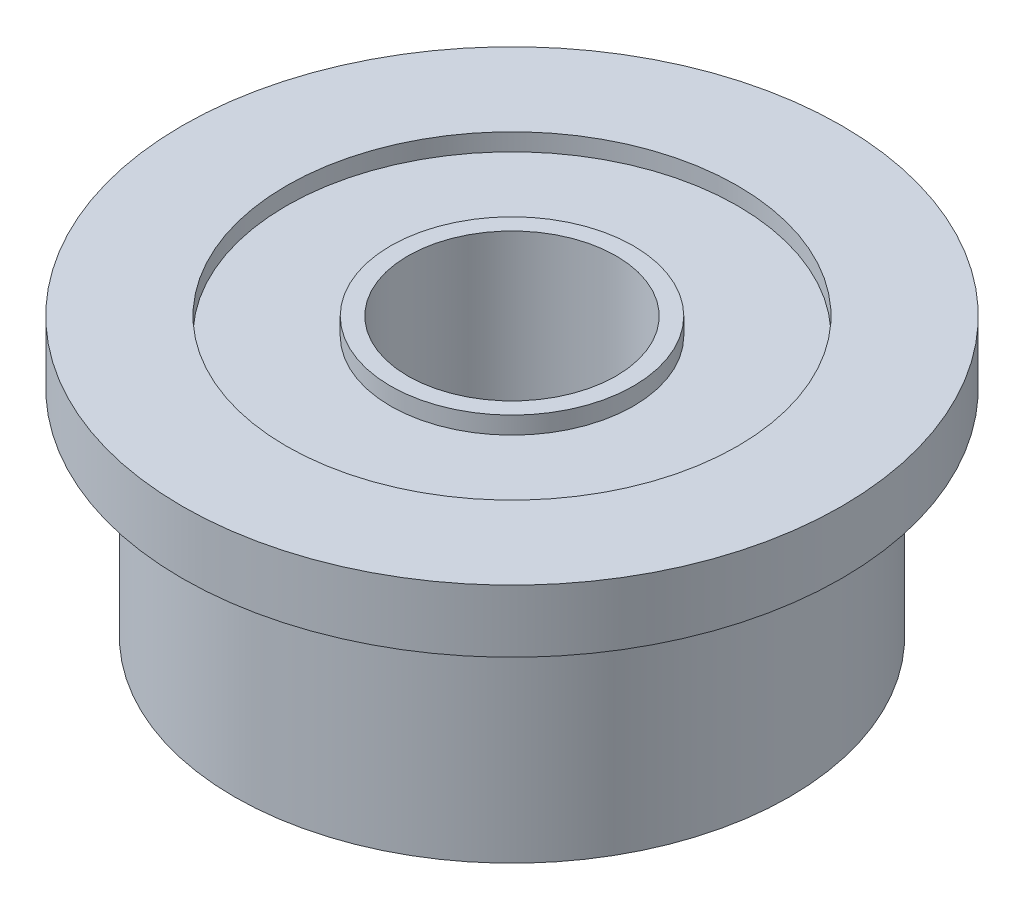
ISO-10303-21;
HEADER;
FILE_DESCRIPTION(('STEP AP214'),'2;1');
FILE_NAME('part.step','',(''),(''),'','','');
FILE_SCHEMA(('AUTOMOTIVE_DESIGN { 1 0 10303 214 1 1 1 1 }'));
ENDSEC;
DATA;
#1=APPLICATION_CONTEXT('core data for automotive mechanical design processes');
#2=APPLICATION_PROTOCOL_DEFINITION('international standard','automotive_design',2000,#1);
#3=PRODUCT_CONTEXT('',#1,'mechanical');
#4=PRODUCT('Part','Part','',(#3));
#5=PRODUCT_RELATED_PRODUCT_CATEGORY('part','',(#4));
#6=PRODUCT_DEFINITION_FORMATION('','',#4);
#7=PRODUCT_DEFINITION_CONTEXT('part definition',#1,'design');
#8=PRODUCT_DEFINITION('design','',#6,#7);
#9=PRODUCT_DEFINITION_SHAPE('','',#8);
#10=(LENGTH_UNIT() NAMED_UNIT(*) SI_UNIT(.MILLI.,.METRE.));
#11=(NAMED_UNIT(*) PLANE_ANGLE_UNIT() SI_UNIT($,.RADIAN.));
#12=(NAMED_UNIT(*) SI_UNIT($,.STERADIAN.) SOLID_ANGLE_UNIT());
#13=UNCERTAINTY_MEASURE_WITH_UNIT(LENGTH_MEASURE(1.E-05),#10,'distance_accuracy_value','');
#14=(GEOMETRIC_REPRESENTATION_CONTEXT(3) GLOBAL_UNCERTAINTY_ASSIGNED_CONTEXT((#13)) GLOBAL_UNIT_ASSIGNED_CONTEXT((#10,
#11,#12)) REPRESENTATION_CONTEXT('',''));
#15=CARTESIAN_POINT('',(0.,0.,0.));
#16=DIRECTION('',(0.,0.,1.));
#17=DIRECTION('',(1.,0.,0.));
#18=AXIS2_PLACEMENT_3D('',#15,#16,#17);
#19=CARTESIAN_POINT('',(0.,4.,0.));
#20=DIRECTION('',(0.,-1.,0.));
#21=DIRECTION('',(0.,0.,-1.));
#22=AXIS2_PLACEMENT_3D('',#19,#20,#21);
#23=CYLINDRICAL_SURFACE('',#22,4.);
#24=CARTESIAN_POINT('',(0.,0.,0.));
#25=DIRECTION('',(0.,1.,0.));
#26=DIRECTION('',(0.,0.,1.));
#27=AXIS2_PLACEMENT_3D('',#24,#25,#26);
#28=CIRCLE('',#27,4.);
#29=CARTESIAN_POINT('',(0.,0.,4.));
#30=VERTEX_POINT('',#29);
#31=EDGE_CURVE('E50',#30,#30,#28,.T.);
#32=ORIENTED_EDGE('',*,*,#31,.T.);
#33=EDGE_LOOP('',(#32));
#34=FACE_BOUND('',#33,.T.);
#35=CARTESIAN_POINT('',(0.,3.1,0.));
#36=DIRECTION('',(0.,1.,0.));
#37=DIRECTION('',(0.,0.,1.));
#38=AXIS2_PLACEMENT_3D('',#35,#36,#37);
#39=CIRCLE('',#38,4.);
#40=CARTESIAN_POINT('',(0.,3.1,4.));
#41=VERTEX_POINT('',#40);
#42=EDGE_CURVE('E10',#41,#41,#39,.T.);
#43=ORIENTED_EDGE('',*,*,#42,.F.);
#44=EDGE_LOOP('',(#43));
#45=FACE_BOUND('',#44,.T.);
#46=ADVANCED_FACE('F41',(#34,#45),#23,.T.);
#47=CARTESIAN_POINT('',(0.,0.,0.));
#48=DIRECTION('',(0.,1.,0.));
#49=DIRECTION('',(0.,0.,1.));
#50=AXIS2_PLACEMENT_3D('',#47,#48,#49);
#51=PLANE('',#50);
#52=CARTESIAN_POINT('',(0.,0.,0.));
#53=DIRECTION('',(0.,1.,0.));
#54=DIRECTION('',(0.,0.,1.));
#55=AXIS2_PLACEMENT_3D('',#52,#53,#54);
#56=CIRCLE('',#55,1.5);
#57=CARTESIAN_POINT('',(0.,0.,1.5));
#58=VERTEX_POINT('',#57);
#59=EDGE_CURVE('E54',#58,#58,#56,.T.);
#60=ORIENTED_EDGE('',*,*,#59,.T.);
#61=EDGE_LOOP('',(#60));
#62=FACE_BOUND('',#61,.T.);
#63=CARTESIAN_POINT('',(0.,0.,0.));
#64=DIRECTION('',(0.,1.,0.));
#65=DIRECTION('',(0.,0.,1.));
#66=AXIS2_PLACEMENT_3D('',#63,#64,#65);
#67=CIRCLE('',#66,1.75);
#68=CARTESIAN_POINT('',(0.,0.,1.75));
#69=VERTEX_POINT('',#68);
#70=EDGE_CURVE('E79',#69,#69,#67,.T.);
#71=ORIENTED_EDGE('',*,*,#70,.F.);
#72=EDGE_LOOP('',(#71));
#73=FACE_BOUND('',#72,.T.);
#74=ADVANCED_FACE('F101',(#62,#73),#51,.F.);
#75=CARTESIAN_POINT('',(0.,4.,0.));
#76=DIRECTION('',(0.,1.,0.));
#77=DIRECTION('',(0.,0.,1.));
#78=AXIS2_PLACEMENT_3D('',#75,#76,#77);
#79=PLANE('',#78);
#80=CARTESIAN_POINT('',(0.,4.,0.));
#81=DIRECTION('',(0.,1.,0.));
#82=DIRECTION('',(0.,0.,1.));
#83=AXIS2_PLACEMENT_3D('',#80,#81,#82);
#84=CIRCLE('',#83,1.5);
#85=CARTESIAN_POINT('',(0.,4.,1.5));
#86=VERTEX_POINT('',#85);
#87=EDGE_CURVE('E51',#86,#86,#84,.T.);
#88=ORIENTED_EDGE('',*,*,#87,.F.);
#89=EDGE_LOOP('',(#88));
#90=FACE_BOUND('',#89,.T.);
#91=CARTESIAN_POINT('',(0.,4.,0.));
#92=DIRECTION('',(0.,1.,0.));
#93=DIRECTION('',(0.,0.,1.));
#94=AXIS2_PLACEMENT_3D('',#91,#92,#93);
#95=CIRCLE('',#94,1.75);
#96=CARTESIAN_POINT('',(0.,4.,1.75));
#97=VERTEX_POINT('',#96);
#98=EDGE_CURVE('E70',#97,#97,#95,.T.);
#99=ORIENTED_EDGE('',*,*,#98,.T.);
#100=EDGE_LOOP('',(#99));
#101=FACE_BOUND('',#100,.T.);
#102=ADVANCED_FACE('F107',(#90,#101),#79,.T.);
#103=CARTESIAN_POINT('',(0.,4.,0.));
#104=DIRECTION('',(0.,1.,0.));
#105=DIRECTION('',(0.,0.,1.));
#106=AXIS2_PLACEMENT_3D('',#103,#104,#105);
#107=CIRCLE('',#106,3.25);
#108=CARTESIAN_POINT('',(0.,4.,3.25));
#109=VERTEX_POINT('',#108);
#110=EDGE_CURVE('E62',#109,#109,#107,.T.);
#111=ORIENTED_EDGE('',*,*,#110,.F.);
#112=EDGE_LOOP('',(#111));
#113=FACE_BOUND('',#112,.T.);
#114=CARTESIAN_POINT('',(0.,4.,0.));
#115=DIRECTION('',(0.,1.,0.));
#116=DIRECTION('',(0.,0.,1.));
#117=AXIS2_PLACEMENT_3D('',#114,#115,#116);
#118=CIRCLE('',#117,4.75);
#119=CARTESIAN_POINT('',(0.,4.,4.75));
#120=VERTEX_POINT('',#119);
#121=EDGE_CURVE('E83',#120,#120,#118,.T.);
#122=ORIENTED_EDGE('',*,*,#121,.T.);
#123=EDGE_LOOP('',(#122));
#124=FACE_BOUND('',#123,.T.);
#125=ADVANCED_FACE('F117',(#113,#124),#79,.T.);
#126=CARTESIAN_POINT('',(0.,0.,0.));
#127=DIRECTION('',(0.,1.,0.));
#128=DIRECTION('',(0.,0.,1.));
#129=AXIS2_PLACEMENT_3D('',#126,#127,#128);
#130=CIRCLE('',#129,3.25);
#131=CARTESIAN_POINT('',(0.,0.,3.25));
#132=VERTEX_POINT('',#131);
#133=EDGE_CURVE('E73',#132,#132,#130,.T.);
#134=ORIENTED_EDGE('',*,*,#133,.T.);
#135=EDGE_LOOP('',(#134));
#136=FACE_BOUND('',#135,.T.);
#137=ORIENTED_EDGE('',*,*,#31,.F.);
#138=EDGE_LOOP('',(#137));
#139=FACE_BOUND('',#138,.T.);
#140=ADVANCED_FACE('F111',(#136,#139),#51,.F.);
#141=CARTESIAN_POINT('',(0.,4.,0.));
#142=DIRECTION('',(0.,-1.,0.));
#143=DIRECTION('',(0.,0.,-1.));
#144=AXIS2_PLACEMENT_3D('',#141,#142,#143);
#145=CYLINDRICAL_SURFACE('',#144,1.5);
#146=ORIENTED_EDGE('',*,*,#87,.T.);
#147=EDGE_LOOP('',(#146));
#148=FACE_BOUND('',#147,.T.);
#149=ORIENTED_EDGE('',*,*,#59,.F.);
#150=EDGE_LOOP('',(#149));
#151=FACE_BOUND('',#150,.T.);
#152=ADVANCED_FACE('F125',(#148,#151),#145,.F.);
#153=CARTESIAN_POINT('',(0.,3.75,0.));
#154=DIRECTION('',(0.,1.,0.));
#155=DIRECTION('',(0.,0.,1.));
#156=AXIS2_PLACEMENT_3D('',#153,#154,#155);
#157=CYLINDRICAL_SURFACE('',#156,3.25);
#158=CARTESIAN_POINT('',(0.,3.75,0.));
#159=DIRECTION('',(0.,1.,0.));
#160=DIRECTION('',(0.,0.,1.));
#161=AXIS2_PLACEMENT_3D('',#158,#159,#160);
#162=CIRCLE('',#161,3.25);
#163=CARTESIAN_POINT('',(0.,3.75,3.25));
#164=VERTEX_POINT('',#163);
#165=EDGE_CURVE('E56',#164,#164,#162,.T.);
#166=ORIENTED_EDGE('',*,*,#165,.F.);
#167=EDGE_LOOP('',(#166));
#168=FACE_BOUND('',#167,.T.);
#169=ORIENTED_EDGE('',*,*,#110,.T.);
#170=EDGE_LOOP('',(#169));
#171=FACE_BOUND('',#170,.T.);
#172=ADVANCED_FACE('F129',(#168,#171),#157,.F.);
#173=CARTESIAN_POINT('',(0.,3.75,0.));
#174=DIRECTION('',(0.,1.,0.));
#175=DIRECTION('',(0.,0.,1.));
#176=AXIS2_PLACEMENT_3D('',#173,#174,#175);
#177=PLANE('',#176);
#178=CARTESIAN_POINT('',(0.,3.75,0.));
#179=DIRECTION('',(0.,1.,0.));
#180=DIRECTION('',(0.,0.,1.));
#181=AXIS2_PLACEMENT_3D('',#178,#179,#180);
#182=CIRCLE('',#181,1.75);
#183=CARTESIAN_POINT('',(0.,3.75,1.75));
#184=VERTEX_POINT('',#183);
#185=EDGE_CURVE('E61',#184,#184,#182,.T.);
#186=ORIENTED_EDGE('',*,*,#185,.F.);
#187=EDGE_LOOP('',(#186));
#188=FACE_BOUND('',#187,.T.);
#189=ORIENTED_EDGE('',*,*,#165,.T.);
#190=EDGE_LOOP('',(#189));
#191=FACE_BOUND('',#190,.T.);
#192=ADVANCED_FACE('F146',(#188,#191),#177,.T.);
#193=CARTESIAN_POINT('',(0.,3.75,0.));
#194=DIRECTION('',(0.,1.,0.));
#195=DIRECTION('',(0.,0.,1.));
#196=AXIS2_PLACEMENT_3D('',#193,#194,#195);
#197=CYLINDRICAL_SURFACE('',#196,1.75);
#198=ORIENTED_EDGE('',*,*,#185,.T.);
#199=EDGE_LOOP('',(#198));
#200=FACE_BOUND('',#199,.T.);
#201=ORIENTED_EDGE('',*,*,#98,.F.);
#202=EDGE_LOOP('',(#201));
#203=FACE_BOUND('',#202,.T.);
#204=ADVANCED_FACE('F144',(#200,#203),#197,.T.);
#205=CARTESIAN_POINT('',(0.,0.25,0.));
#206=DIRECTION('',(0.,-1.,0.));
#207=DIRECTION('',(0.,0.,1.));
#208=AXIS2_PLACEMENT_3D('',#205,#206,#207);
#209=PLANE('',#208);
#210=CARTESIAN_POINT('',(0.,0.25,0.));
#211=DIRECTION('',(0.,1.,0.));
#212=DIRECTION('',(0.,0.,1.));
#213=AXIS2_PLACEMENT_3D('',#210,#211,#212);
#214=CIRCLE('',#213,3.25);
#215=CARTESIAN_POINT('',(0.,0.25,3.25));
#216=VERTEX_POINT('',#215);
#217=EDGE_CURVE('E69',#216,#216,#214,.T.);
#218=ORIENTED_EDGE('',*,*,#217,.F.);
#219=EDGE_LOOP('',(#218));
#220=FACE_BOUND('',#219,.T.);
#221=CARTESIAN_POINT('',(0.,0.25,0.));
#222=DIRECTION('',(0.,1.,0.));
#223=DIRECTION('',(0.,0.,1.));
#224=AXIS2_PLACEMENT_3D('',#221,#222,#223);
#225=CIRCLE('',#224,1.75);
#226=CARTESIAN_POINT('',(0.,0.25,1.75));
#227=VERTEX_POINT('',#226);
#228=EDGE_CURVE('E77',#227,#227,#225,.T.);
#229=ORIENTED_EDGE('',*,*,#228,.T.);
#230=EDGE_LOOP('',(#229));
#231=FACE_BOUND('',#230,.T.);
#232=ADVANCED_FACE('F140',(#220,#231),#209,.T.);
#233=CARTESIAN_POINT('',(0.,0.25,0.));
#234=DIRECTION('',(0.,-1.,0.));
#235=DIRECTION('',(0.,0.,-1.));
#236=AXIS2_PLACEMENT_3D('',#233,#234,#235);
#237=CYLINDRICAL_SURFACE('',#236,3.25);
#238=ORIENTED_EDGE('',*,*,#217,.T.);
#239=EDGE_LOOP('',(#238));
#240=FACE_BOUND('',#239,.T.);
#241=ORIENTED_EDGE('',*,*,#133,.F.);
#242=EDGE_LOOP('',(#241));
#243=FACE_BOUND('',#242,.T.);
#244=ADVANCED_FACE('F134',(#240,#243),#237,.F.);
#245=CARTESIAN_POINT('',(0.,0.25,0.));
#246=DIRECTION('',(0.,-1.,0.));
#247=DIRECTION('',(0.,0.,-1.));
#248=AXIS2_PLACEMENT_3D('',#245,#246,#247);
#249=CYLINDRICAL_SURFACE('',#248,1.75);
#250=ORIENTED_EDGE('',*,*,#228,.F.);
#251=EDGE_LOOP('',(#250));
#252=FACE_BOUND('',#251,.T.);
#253=ORIENTED_EDGE('',*,*,#70,.T.);
#254=EDGE_LOOP('',(#253));
#255=FACE_BOUND('',#254,.T.);
#256=ADVANCED_FACE('F99',(#252,#255),#249,.T.);
#257=CARTESIAN_POINT('',(0.,3.1,0.));
#258=DIRECTION('',(0.,1.,0.));
#259=DIRECTION('',(0.,0.,1.));
#260=AXIS2_PLACEMENT_3D('',#257,#258,#259);
#261=CYLINDRICAL_SURFACE('',#260,4.75);
#262=CARTESIAN_POINT('',(0.,3.1,0.));
#263=DIRECTION('',(0.,1.,0.));
#264=DIRECTION('',(0.,0.,1.));
#265=AXIS2_PLACEMENT_3D('',#262,#263,#264);
#266=CIRCLE('',#265,4.75);
#267=CARTESIAN_POINT('',(0.,3.1,4.75));
#268=VERTEX_POINT('',#267);
#269=EDGE_CURVE('E85',#268,#268,#266,.T.);
#270=ORIENTED_EDGE('',*,*,#269,.T.);
#271=EDGE_LOOP('',(#270));
#272=FACE_BOUND('',#271,.T.);
#273=ORIENTED_EDGE('',*,*,#121,.F.);
#274=EDGE_LOOP('',(#273));
#275=FACE_BOUND('',#274,.T.);
#276=ADVANCED_FACE('F91',(#272,#275),#261,.T.);
#277=CARTESIAN_POINT('',(0.,3.1,0.));
#278=DIRECTION('',(0.,1.,0.));
#279=DIRECTION('',(0.,0.,1.));
#280=AXIS2_PLACEMENT_3D('',#277,#278,#279);
#281=PLANE('',#280);
#282=ORIENTED_EDGE('',*,*,#42,.T.);
#283=EDGE_LOOP('',(#282));
#284=FACE_BOUND('',#283,.T.);
#285=ORIENTED_EDGE('',*,*,#269,.F.);
#286=EDGE_LOOP('',(#285));
#287=FACE_BOUND('',#286,.T.);
#288=ADVANCED_FACE('F92',(#284,#287),#281,.F.);
#289=CLOSED_SHELL('',(#46,#74,#102,#125,#140,#152,#172,#192,#204,#232,#244,#256,#276,#288));
#290=MANIFOLD_SOLID_BREP('B2',#289);
#291=ADVANCED_BREP_SHAPE_REPRESENTATION('',(#18,#290),#14);
#292=SHAPE_DEFINITION_REPRESENTATION(#9,#291);
ENDSEC;
END-ISO-10303-21;
